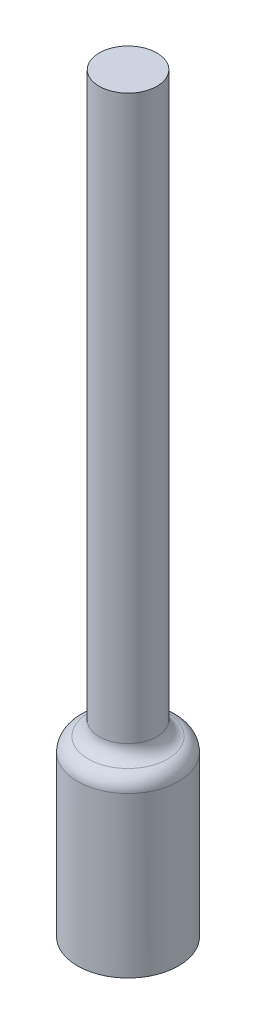
ISO-10303-21;
HEADER;
FILE_DESCRIPTION(('STEP AP214'),'2;1');
FILE_NAME('part.step','',(''),(''),'','','');
FILE_SCHEMA(('AUTOMOTIVE_DESIGN { 1 0 10303 214 1 1 1 1 }'));
ENDSEC;
DATA;
#1=APPLICATION_CONTEXT('core data for automotive mechanical design processes');
#2=APPLICATION_PROTOCOL_DEFINITION('international standard','automotive_design',2000,#1);
#3=PRODUCT_CONTEXT('',#1,'mechanical');
#4=PRODUCT('Part','Part','',(#3));
#5=PRODUCT_RELATED_PRODUCT_CATEGORY('part','',(#4));
#6=PRODUCT_DEFINITION_FORMATION('','',#4);
#7=PRODUCT_DEFINITION_CONTEXT('part definition',#1,'design');
#8=PRODUCT_DEFINITION('design','',#6,#7);
#9=PRODUCT_DEFINITION_SHAPE('','',#8);
#10=(LENGTH_UNIT() NAMED_UNIT(*) SI_UNIT(.MILLI.,.METRE.));
#11=(NAMED_UNIT(*) PLANE_ANGLE_UNIT() SI_UNIT($,.RADIAN.));
#12=(NAMED_UNIT(*) SI_UNIT($,.STERADIAN.) SOLID_ANGLE_UNIT());
#13=UNCERTAINTY_MEASURE_WITH_UNIT(LENGTH_MEASURE(1.E-05),#10,'distance_accuracy_value','');
#14=(GEOMETRIC_REPRESENTATION_CONTEXT(3) GLOBAL_UNCERTAINTY_ASSIGNED_CONTEXT((#13)) GLOBAL_UNIT_ASSIGNED_CONTEXT((#10,
#11,#12)) REPRESENTATION_CONTEXT('',''));
#15=CARTESIAN_POINT('',(0.,0.,0.));
#16=DIRECTION('',(0.,0.,1.));
#17=DIRECTION('',(1.,0.,0.));
#18=AXIS2_PLACEMENT_3D('',#15,#16,#17);
#19=CARTESIAN_POINT('',(0.,0.,0.));
#20=DIRECTION('',(0.,1.,0.));
#21=DIRECTION('',(0.,0.,1.));
#22=AXIS2_PLACEMENT_3D('',#19,#20,#21);
#23=PLANE('',#22);
#24=CARTESIAN_POINT('',(0.,0.,0.));
#25=DIRECTION('',(0.,1.,0.));
#26=DIRECTION('',(0.,0.,1.));
#27=AXIS2_PLACEMENT_3D('',#24,#25,#26);
#28=CIRCLE('',#27,3.5);
#29=CARTESIAN_POINT('',(0.,0.,3.5));
#30=VERTEX_POINT('',#29);
#31=EDGE_CURVE('E44',#30,#30,#28,.T.);
#32=ORIENTED_EDGE('',*,*,#31,.F.);
#33=EDGE_LOOP('',(#32));
#34=FACE_BOUND('',#33,.T.);
#35=CARTESIAN_POINT('',(0.,0.,0.));
#36=DIRECTION('',(0.,1.,0.));
#37=DIRECTION('',(0.,0.,1.));
#38=AXIS2_PLACEMENT_3D('',#35,#36,#37);
#39=CIRCLE('',#38,1.99);
#40=CARTESIAN_POINT('',(0.,0.,1.99));
#41=VERTEX_POINT('',#40);
#42=EDGE_CURVE('E49',#41,#41,#39,.T.);
#43=ORIENTED_EDGE('',*,*,#42,.T.);
#44=EDGE_LOOP('',(#43));
#45=FACE_BOUND('',#44,.T.);
#46=ADVANCED_FACE('F29',(#34,#45),#23,.F.);
#47=CARTESIAN_POINT('',(0.,12.,0.));
#48=DIRECTION('',(0.,-1.,0.));
#49=DIRECTION('',(0.,0.,-1.));
#50=AXIS2_PLACEMENT_3D('',#47,#48,#49);
#51=CYLINDRICAL_SURFACE('',#50,3.5);
#52=CARTESIAN_POINT('',(0.,11.0635083268963,0.));
#53=DIRECTION('',(0.,-1.,0.));
#54=DIRECTION('',(0.,0.,-1.));
#55=AXIS2_PLACEMENT_3D('',#52,#53,#54);
#56=CIRCLE('',#55,3.5);
#57=CARTESIAN_POINT('',(0.,11.0635083268963,-3.5));
#58=VERTEX_POINT('',#57);
#59=EDGE_CURVE('E10',#58,#58,#56,.T.);
#60=ORIENTED_EDGE('',*,*,#59,.T.);
#61=EDGE_LOOP('',(#60));
#62=FACE_BOUND('',#61,.T.);
#63=ORIENTED_EDGE('',*,*,#31,.T.);
#64=EDGE_LOOP('',(#63));
#65=FACE_BOUND('',#64,.T.);
#66=ADVANCED_FACE('F77',(#62,#65),#51,.T.);
#67=CARTESIAN_POINT('',(0.,12.,0.));
#68=DIRECTION('',(0.,-1.,0.));
#69=DIRECTION('',(0.,0.,-1.));
#70=AXIS2_PLACEMENT_3D('',#67,#68,#69);
#71=CYLINDRICAL_SURFACE('',#70,1.99);
#72=CARTESIAN_POINT('',(0.,12.,0.));
#73=DIRECTION('',(0.,1.,0.));
#74=DIRECTION('',(0.,0.,1.));
#75=AXIS2_PLACEMENT_3D('',#72,#73,#74);
#76=CIRCLE('',#75,1.99);
#77=CARTESIAN_POINT('',(0.,12.,1.99));
#78=VERTEX_POINT('',#77);
#79=EDGE_CURVE('E52',#78,#78,#76,.T.);
#80=ORIENTED_EDGE('',*,*,#79,.T.);
#81=EDGE_LOOP('',(#80));
#82=FACE_BOUND('',#81,.T.);
#83=ORIENTED_EDGE('',*,*,#42,.F.);
#84=EDGE_LOOP('',(#83));
#85=FACE_BOUND('',#84,.T.);
#86=ADVANCED_FACE('F72',(#82,#85),#71,.F.);
#87=CARTESIAN_POINT('',(0.,12.,0.));
#88=DIRECTION('',(0.,1.,0.));
#89=DIRECTION('',(0.,0.,1.));
#90=AXIS2_PLACEMENT_3D('',#87,#88,#89);
#91=PLANE('',#90);
#92=ORIENTED_EDGE('',*,*,#79,.F.);
#93=EDGE_LOOP('',(#92));
#94=FACE_BOUND('',#93,.T.);
#95=ADVANCED_FACE('F63',(#94),#91,.F.);
#96=CARTESIAN_POINT('',(0.,52.,0.));
#97=DIRECTION('',(0.,-1.,0.));
#98=DIRECTION('',(0.,0.,-1.));
#99=AXIS2_PLACEMENT_3D('',#96,#97,#98);
#100=CYLINDRICAL_SURFACE('',#99,2.);
#101=CARTESIAN_POINT('',(0.,13.,0.));
#102=DIRECTION('',(0.,1.,0.));
#103=DIRECTION('',(0.,0.,1.));
#104=AXIS2_PLACEMENT_3D('',#101,#102,#103);
#105=CIRCLE('',#104,2.);
#106=CARTESIAN_POINT('',(0.,13.,2.));
#107=VERTEX_POINT('',#106);
#108=EDGE_CURVE('E40',#107,#107,#105,.T.);
#109=ORIENTED_EDGE('',*,*,#108,.T.);
#110=EDGE_LOOP('',(#109));
#111=FACE_BOUND('',#110,.T.);
#112=CARTESIAN_POINT('',(0.,52.,0.));
#113=DIRECTION('',(0.,1.,0.));
#114=DIRECTION('',(0.,0.,1.));
#115=AXIS2_PLACEMENT_3D('',#112,#113,#114);
#116=CIRCLE('',#115,2.);
#117=CARTESIAN_POINT('',(0.,52.,2.));
#118=VERTEX_POINT('',#117);
#119=EDGE_CURVE('E55',#118,#118,#116,.T.);
#120=ORIENTED_EDGE('',*,*,#119,.F.);
#121=EDGE_LOOP('',(#120));
#122=FACE_BOUND('',#121,.T.);
#123=ADVANCED_FACE('F61',(#111,#122),#100,.T.);
#124=CARTESIAN_POINT('',(0.,52.,0.));
#125=DIRECTION('',(0.,1.,0.));
#126=DIRECTION('',(0.,0.,1.));
#127=AXIS2_PLACEMENT_3D('',#124,#125,#126);
#128=PLANE('',#127);
#129=ORIENTED_EDGE('',*,*,#119,.T.);
#130=EDGE_LOOP('',(#129));
#131=FACE_BOUND('',#130,.T.);
#132=ADVANCED_FACE('F59',(#131),#128,.T.);
#133=CARTESIAN_POINT('',(0.,13.,0.));
#134=DIRECTION('',(0.,1.,0.));
#135=DIRECTION('',(0.,0.,1.));
#136=AXIS2_PLACEMENT_3D('',#133,#134,#135);
#137=TOROIDAL_SURFACE('',#136,3.,1.);
#138=CARTESIAN_POINT('',(0.,12.0317541634481,0.));
#139=DIRECTION('',(0.,1.,0.));
#140=DIRECTION('',(0.,0.,1.));
#141=AXIS2_PLACEMENT_3D('',#138,#139,#140);
#142=CIRCLE('',#141,2.75);
#143=CARTESIAN_POINT('',(0.,12.0317541634481,2.75));
#144=VERTEX_POINT('',#143);
#145=EDGE_CURVE('E36',#144,#144,#142,.T.);
#146=ORIENTED_EDGE('',*,*,#145,.T.);
#147=EDGE_LOOP('',(#146));
#148=FACE_BOUND('',#147,.T.);
#149=ORIENTED_EDGE('',*,*,#108,.F.);
#150=EDGE_LOOP('',(#149));
#151=FACE_BOUND('',#150,.T.);
#152=ADVANCED_FACE('F70',(#148,#151),#137,.F.);
#153=CARTESIAN_POINT('',(0.,11.0635083268963,0.));
#154=DIRECTION('',(0.,-1.,0.));
#155=DIRECTION('',(0.,0.,-1.));
#156=AXIS2_PLACEMENT_3D('',#153,#154,#155);
#157=TOROIDAL_SURFACE('',#156,2.5,1.);
#158=ORIENTED_EDGE('',*,*,#59,.F.);
#159=EDGE_LOOP('',(#158));
#160=FACE_BOUND('',#159,.T.);
#161=ORIENTED_EDGE('',*,*,#145,.F.);
#162=EDGE_LOOP('',(#161));
#163=FACE_BOUND('',#162,.T.);
#164=ADVANCED_FACE('F31',(#160,#163),#157,.T.);
#165=CLOSED_SHELL('',(#46,#66,#86,#95,#123,#132,#152,#164));
#166=MANIFOLD_SOLID_BREP('B2',#165);
#167=ADVANCED_BREP_SHAPE_REPRESENTATION('',(#18,#166),#14);
#168=SHAPE_DEFINITION_REPRESENTATION(#9,#167);
ENDSEC;
END-ISO-10303-21;
